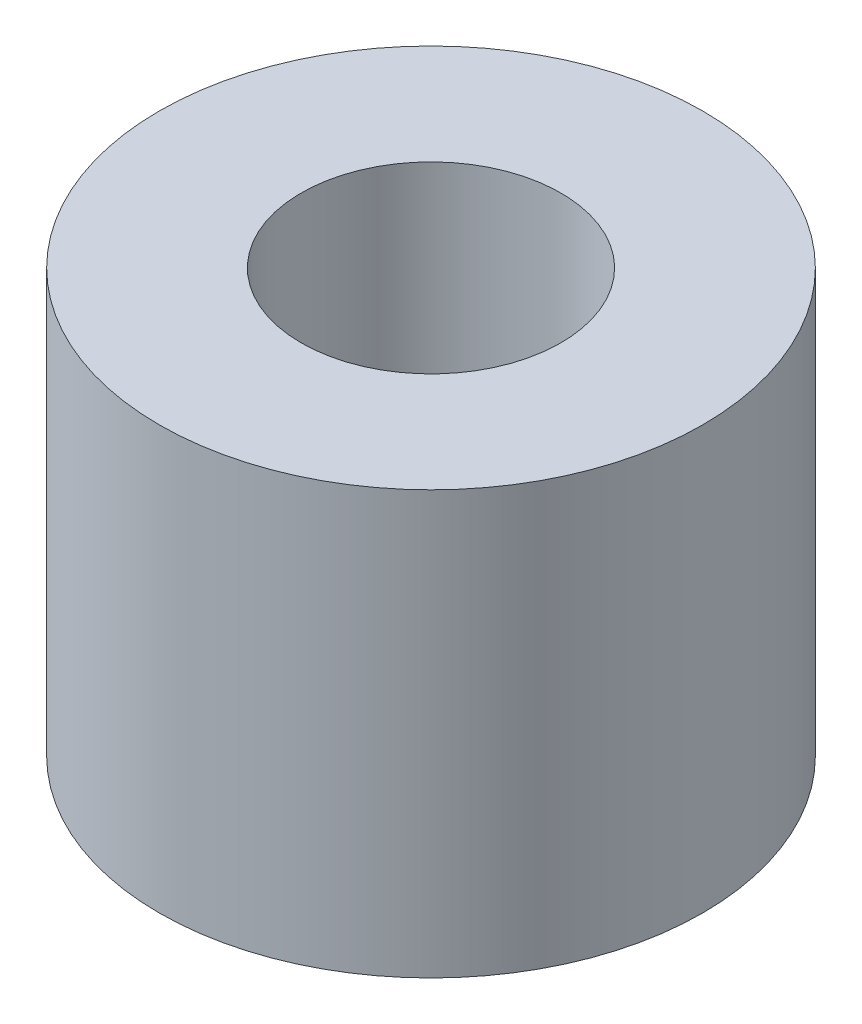
ISO-10303-21;
HEADER;
FILE_DESCRIPTION(('STEP AP214'),'2;1');
FILE_NAME('part.step','',(''),(''),'','','');
FILE_SCHEMA(('AUTOMOTIVE_DESIGN { 1 0 10303 214 1 1 1 1 }'));
ENDSEC;
DATA;
#1=APPLICATION_CONTEXT('core data for automotive mechanical design processes');
#2=APPLICATION_PROTOCOL_DEFINITION('international standard','automotive_design',2000,#1);
#3=PRODUCT_CONTEXT('',#1,'mechanical');
#4=PRODUCT('Part','Part','',(#3));
#5=PRODUCT_RELATED_PRODUCT_CATEGORY('part','',(#4));
#6=PRODUCT_DEFINITION_FORMATION('','',#4);
#7=PRODUCT_DEFINITION_CONTEXT('part definition',#1,'design');
#8=PRODUCT_DEFINITION('design','',#6,#7);
#9=PRODUCT_DEFINITION_SHAPE('','',#8);
#10=(LENGTH_UNIT() NAMED_UNIT(*) SI_UNIT(.MILLI.,.METRE.));
#11=(NAMED_UNIT(*) PLANE_ANGLE_UNIT() SI_UNIT($,.RADIAN.));
#12=(NAMED_UNIT(*) SI_UNIT($,.STERADIAN.) SOLID_ANGLE_UNIT());
#13=UNCERTAINTY_MEASURE_WITH_UNIT(LENGTH_MEASURE(1.E-05),#10,'distance_accuracy_value','');
#14=(GEOMETRIC_REPRESENTATION_CONTEXT(3) GLOBAL_UNCERTAINTY_ASSIGNED_CONTEXT((#13)) GLOBAL_UNIT_ASSIGNED_CONTEXT((#10,
#11,#12)) REPRESENTATION_CONTEXT('',''));
#15=CARTESIAN_POINT('',(0.,0.,0.));
#16=DIRECTION('',(0.,0.,1.));
#17=DIRECTION('',(1.,0.,0.));
#18=AXIS2_PLACEMENT_3D('',#15,#16,#17);
#19=CARTESIAN_POINT('',(0.,7.,0.));
#20=DIRECTION('',(0.,1.,0.));
#21=DIRECTION('',(0.,0.,1.));
#22=AXIS2_PLACEMENT_3D('',#19,#20,#21);
#23=PLANE('',#22);
#24=CARTESIAN_POINT('',(0.,7.,0.));
#25=DIRECTION('',(0.,1.,0.));
#26=DIRECTION('',(0.,0.,1.));
#27=AXIS2_PLACEMENT_3D('',#24,#25,#26);
#28=CIRCLE('',#27,4.5);
#29=CARTESIAN_POINT('',(0.,7.,4.5));
#30=VERTEX_POINT('',#29);
#31=EDGE_CURVE('E10',#30,#30,#28,.T.);
#32=ORIENTED_EDGE('',*,*,#31,.T.);
#33=EDGE_LOOP('',(#32));
#34=FACE_BOUND('',#33,.T.);
#35=CARTESIAN_POINT('',(0.,7.,0.));
#36=DIRECTION('',(0.,1.,0.));
#37=DIRECTION('',(0.,0.,1.));
#38=AXIS2_PLACEMENT_3D('',#35,#36,#37);
#39=CIRCLE('',#38,2.15);
#40=CARTESIAN_POINT('',(0.,7.,2.15));
#41=VERTEX_POINT('',#40);
#42=EDGE_CURVE('E43',#41,#41,#39,.T.);
#43=ORIENTED_EDGE('',*,*,#42,.F.);
#44=EDGE_LOOP('',(#43));
#45=FACE_BOUND('',#44,.T.);
#46=ADVANCED_FACE('F32',(#34,#45),#23,.T.);
#47=CARTESIAN_POINT('',(0.,0.,0.));
#48=DIRECTION('',(0.,1.,0.));
#49=DIRECTION('',(0.,0.,1.));
#50=AXIS2_PLACEMENT_3D('',#47,#48,#49);
#51=PLANE('',#50);
#52=CARTESIAN_POINT('',(0.,0.,0.));
#53=DIRECTION('',(0.,1.,0.));
#54=DIRECTION('',(0.,0.,1.));
#55=AXIS2_PLACEMENT_3D('',#52,#53,#54);
#56=CIRCLE('',#55,4.5);
#57=CARTESIAN_POINT('',(0.,0.,4.5));
#58=VERTEX_POINT('',#57);
#59=EDGE_CURVE('E36',#58,#58,#56,.T.);
#60=ORIENTED_EDGE('',*,*,#59,.F.);
#61=EDGE_LOOP('',(#60));
#62=FACE_BOUND('',#61,.T.);
#63=CARTESIAN_POINT('',(0.,0.,0.));
#64=DIRECTION('',(0.,1.,0.));
#65=DIRECTION('',(0.,0.,1.));
#66=AXIS2_PLACEMENT_3D('',#63,#64,#65);
#67=CIRCLE('',#66,2.15);
#68=CARTESIAN_POINT('',(0.,0.,2.15));
#69=VERTEX_POINT('',#68);
#70=EDGE_CURVE('E45',#69,#69,#67,.T.);
#71=ORIENTED_EDGE('',*,*,#70,.T.);
#72=EDGE_LOOP('',(#71));
#73=FACE_BOUND('',#72,.T.);
#74=ADVANCED_FACE('F55',(#62,#73),#51,.F.);
#75=CARTESIAN_POINT('',(0.,7.,0.));
#76=DIRECTION('',(0.,-1.,0.));
#77=DIRECTION('',(0.,0.,-1.));
#78=AXIS2_PLACEMENT_3D('',#75,#76,#77);
#79=CYLINDRICAL_SURFACE('',#78,4.5);
#80=ORIENTED_EDGE('',*,*,#31,.F.);
#81=EDGE_LOOP('',(#80));
#82=FACE_BOUND('',#81,.T.);
#83=ORIENTED_EDGE('',*,*,#59,.T.);
#84=EDGE_LOOP('',(#83));
#85=FACE_BOUND('',#84,.T.);
#86=ADVANCED_FACE('F34',(#82,#85),#79,.T.);
#87=CARTESIAN_POINT('',(0.,7.,0.));
#88=DIRECTION('',(0.,-1.,0.));
#89=DIRECTION('',(0.,0.,-1.));
#90=AXIS2_PLACEMENT_3D('',#87,#88,#89);
#91=CYLINDRICAL_SURFACE('',#90,2.15);
#92=ORIENTED_EDGE('',*,*,#42,.T.);
#93=EDGE_LOOP('',(#92));
#94=FACE_BOUND('',#93,.T.);
#95=ORIENTED_EDGE('',*,*,#70,.F.);
#96=EDGE_LOOP('',(#95));
#97=FACE_BOUND('',#96,.T.);
#98=ADVANCED_FACE('F51',(#94,#97),#91,.F.);
#99=CLOSED_SHELL('',(#46,#74,#86,#98));
#100=MANIFOLD_SOLID_BREP('B2',#99);
#101=ADVANCED_BREP_SHAPE_REPRESENTATION('',(#18,#100),#14);
#102=SHAPE_DEFINITION_REPRESENTATION(#9,#101);
ENDSEC;
END-ISO-10303-21;
